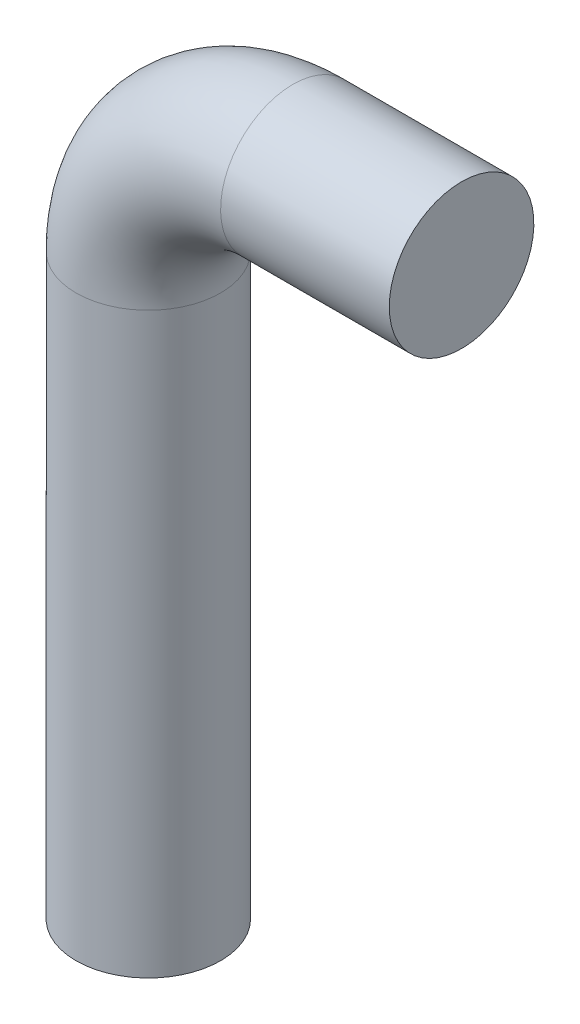
ISO-10303-21;
HEADER;
FILE_DESCRIPTION(('STEP AP214'),'2;1');
FILE_NAME('part.step','',(''),(''),'','','');
FILE_SCHEMA(('AUTOMOTIVE_DESIGN { 1 0 10303 214 1 1 1 1 }'));
ENDSEC;
DATA;
#1=APPLICATION_CONTEXT('core data for automotive mechanical design processes');
#2=APPLICATION_PROTOCOL_DEFINITION('international standard','automotive_design',2000,#1);
#3=PRODUCT_CONTEXT('',#1,'mechanical');
#4=PRODUCT('Part','Part','',(#3));
#5=PRODUCT_RELATED_PRODUCT_CATEGORY('part','',(#4));
#6=PRODUCT_DEFINITION_FORMATION('','',#4);
#7=PRODUCT_DEFINITION_CONTEXT('part definition',#1,'design');
#8=PRODUCT_DEFINITION('design','',#6,#7);
#9=PRODUCT_DEFINITION_SHAPE('','',#8);
#10=(LENGTH_UNIT() NAMED_UNIT(*) SI_UNIT(.MILLI.,.METRE.));
#11=(NAMED_UNIT(*) PLANE_ANGLE_UNIT() SI_UNIT($,.RADIAN.));
#12=(NAMED_UNIT(*) SI_UNIT($,.STERADIAN.) SOLID_ANGLE_UNIT());
#13=UNCERTAINTY_MEASURE_WITH_UNIT(LENGTH_MEASURE(1.E-05),#10,'distance_accuracy_value','');
#14=(GEOMETRIC_REPRESENTATION_CONTEXT(3) GLOBAL_UNCERTAINTY_ASSIGNED_CONTEXT((#13)) GLOBAL_UNIT_ASSIGNED_CONTEXT((#10,
#11,#12)) REPRESENTATION_CONTEXT('',''));
#15=CARTESIAN_POINT('',(0.,0.,0.));
#16=DIRECTION('',(0.,0.,1.));
#17=DIRECTION('',(1.,0.,0.));
#18=AXIS2_PLACEMENT_3D('',#15,#16,#17);
#19=CARTESIAN_POINT('',(0.,0.,0.));
#20=DIRECTION('',(0.,1.,0.));
#21=DIRECTION('',(0.,0.,1.));
#22=AXIS2_PLACEMENT_3D('',#19,#20,#21);
#23=PLANE('',#22);
#24=CARTESIAN_POINT('',(0.,0.,0.));
#25=DIRECTION('',(0.,1.,0.));
#26=DIRECTION('',(0.,0.,1.));
#27=AXIS2_PLACEMENT_3D('',#24,#25,#26);
#28=CIRCLE('',#27,1.5);
#29=CARTESIAN_POINT('',(0.,0.,1.5));
#30=VERTEX_POINT('',#29);
#31=EDGE_CURVE('E52',#30,#30,#28,.T.);
#32=ORIENTED_EDGE('',*,*,#31,.F.);
#33=EDGE_LOOP('',(#32));
#34=FACE_BOUND('',#33,.T.);
#35=ADVANCED_FACE('F39',(#34),#23,.F.);
#36=CARTESIAN_POINT('',(6.5,15.,0.));
#37=DIRECTION('',(1.,0.,0.));
#38=DIRECTION('',(0.,0.,1.));
#39=AXIS2_PLACEMENT_3D('',#36,#37,#38);
#40=PLANE('',#39);
#41=CARTESIAN_POINT('',(6.5,15.,0.));
#42=DIRECTION('',(1.,0.,0.));
#43=DIRECTION('',(0.,0.,1.));
#44=AXIS2_PLACEMENT_3D('',#41,#42,#43);
#45=CIRCLE('',#44,1.5);
#46=CARTESIAN_POINT('',(6.5,15.,1.5));
#47=VERTEX_POINT('',#46);
#48=EDGE_CURVE('E10',#47,#47,#45,.T.);
#49=ORIENTED_EDGE('',*,*,#48,.T.);
#50=EDGE_LOOP('',(#49));
#51=FACE_BOUND('',#50,.T.);
#52=ADVANCED_FACE('F65',(#51),#40,.T.);
#53=CARTESIAN_POINT('',(0.,0.,0.));
#54=DIRECTION('',(0.,1.,0.));
#55=DIRECTION('',(0.,0.,1.));
#56=AXIS2_PLACEMENT_3D('',#53,#54,#55);
#57=CYLINDRICAL_SURFACE('',#56,1.5);
#58=CARTESIAN_POINT('',(0.,12.,0.));
#59=DIRECTION('',(0.,1.,0.));
#60=DIRECTION('',(0.,0.,1.));
#61=AXIS2_PLACEMENT_3D('',#58,#59,#60);
#62=CIRCLE('',#61,1.5);
#63=CARTESIAN_POINT('',(-1.5,12.,0.));
#64=VERTEX_POINT('',#63);
#65=EDGE_CURVE('E47',#64,#64,#62,.T.);
#66=ORIENTED_EDGE('',*,*,#65,.F.);
#67=EDGE_LOOP('',(#66));
#68=FACE_BOUND('',#67,.T.);
#69=ORIENTED_EDGE('',*,*,#31,.T.);
#70=EDGE_LOOP('',(#69));
#71=FACE_BOUND('',#70,.T.);
#72=ADVANCED_FACE('F56',(#68,#71),#57,.T.);
#73=CARTESIAN_POINT('',(3.,12.,0.));
#74=DIRECTION('',(0.,0.,-1.));
#75=DIRECTION('',(-1.,0.,0.));
#76=AXIS2_PLACEMENT_3D('',#73,#74,#75);
#77=TOROIDAL_SURFACE('',#76,3.,1.5);
#78=CARTESIAN_POINT('',(3.,15.,0.));
#79=DIRECTION('',(1.,0.,0.));
#80=DIRECTION('',(0.,0.,1.));
#81=AXIS2_PLACEMENT_3D('',#78,#79,#80);
#82=CIRCLE('',#81,1.5);
#83=CARTESIAN_POINT('',(3.,16.5,0.));
#84=VERTEX_POINT('',#83);
#85=EDGE_CURVE('E44',#84,#84,#82,.T.);
#86=CARTESIAN_POINT('',(3.,12.,0.));
#87=DIRECTION('',(0.,0.,-1.));
#88=DIRECTION('',(-1.,0.,0.));
#89=AXIS2_PLACEMENT_3D('',#86,#87,#88);
#90=CIRCLE('',#89,4.5);
#91=EDGE_CURVE('',#64,#84,#90,.T.);
#92=ORIENTED_EDGE('',*,*,#65,.T.);
#93=ORIENTED_EDGE('',*,*,#85,.F.);
#94=ORIENTED_EDGE('',*,*,#91,.T.);
#95=ORIENTED_EDGE('',*,*,#91,.F.);
#96=EDGE_LOOP('',(#92,#94,#93,#95));
#97=FACE_BOUND('',#96,.T.);
#98=ADVANCED_FACE('F66',(#97),#77,.T.);
#99=CARTESIAN_POINT('',(3.,15.,0.));
#100=DIRECTION('',(1.,0.,0.));
#101=DIRECTION('',(0.,0.,-1.));
#102=AXIS2_PLACEMENT_3D('',#99,#100,#101);
#103=CYLINDRICAL_SURFACE('',#102,1.5);
#104=ORIENTED_EDGE('',*,*,#48,.F.);
#105=EDGE_LOOP('',(#104));
#106=FACE_BOUND('',#105,.T.);
#107=ORIENTED_EDGE('',*,*,#85,.T.);
#108=EDGE_LOOP('',(#107));
#109=FACE_BOUND('',#108,.T.);
#110=ADVANCED_FACE('F67',(#106,#109),#103,.T.);
#111=CLOSED_SHELL('',(#35,#52,#72,#98,#110));
#112=MANIFOLD_SOLID_BREP('B2',#111);
#113=ADVANCED_BREP_SHAPE_REPRESENTATION('',(#18,#112),#14);
#114=SHAPE_DEFINITION_REPRESENTATION(#9,#113);
ENDSEC;
END-ISO-10303-21;
